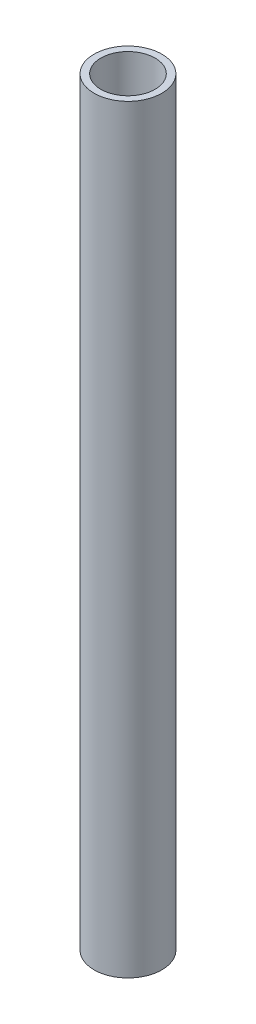
ISO-10303-21;
HEADER;
FILE_DESCRIPTION(('STEP AP214'),'2;1');
FILE_NAME('part.step','',(''),(''),'','','');
FILE_SCHEMA(('AUTOMOTIVE_DESIGN { 1 0 10303 214 1 1 1 1 }'));
ENDSEC;
DATA;
#1=APPLICATION_CONTEXT('core data for automotive mechanical design processes');
#2=APPLICATION_PROTOCOL_DEFINITION('international standard','automotive_design',2000,#1);
#3=PRODUCT_CONTEXT('',#1,'mechanical');
#4=PRODUCT('Part','Part','',(#3));
#5=PRODUCT_RELATED_PRODUCT_CATEGORY('part','',(#4));
#6=PRODUCT_DEFINITION_FORMATION('','',#4);
#7=PRODUCT_DEFINITION_CONTEXT('part definition',#1,'design');
#8=PRODUCT_DEFINITION('design','',#6,#7);
#9=PRODUCT_DEFINITION_SHAPE('','',#8);
#10=(LENGTH_UNIT() NAMED_UNIT(*) SI_UNIT(.MILLI.,.METRE.));
#11=(NAMED_UNIT(*) PLANE_ANGLE_UNIT() SI_UNIT($,.RADIAN.));
#12=(NAMED_UNIT(*) SI_UNIT($,.STERADIAN.) SOLID_ANGLE_UNIT());
#13=UNCERTAINTY_MEASURE_WITH_UNIT(LENGTH_MEASURE(1.E-05),#10,'distance_accuracy_value','');
#14=(GEOMETRIC_REPRESENTATION_CONTEXT(3) GLOBAL_UNCERTAINTY_ASSIGNED_CONTEXT((#13)) GLOBAL_UNIT_ASSIGNED_CONTEXT((#10,
#11,#12)) REPRESENTATION_CONTEXT('',''));
#15=CARTESIAN_POINT('',(0.,0.,0.));
#16=DIRECTION('',(0.,0.,1.));
#17=DIRECTION('',(1.,0.,0.));
#18=AXIS2_PLACEMENT_3D('',#15,#16,#17);
#19=CARTESIAN_POINT('',(0.,28.,0.));
#20=DIRECTION('',(0.,1.,0.));
#21=DIRECTION('',(0.,0.,1.));
#22=AXIS2_PLACEMENT_3D('',#19,#20,#21);
#23=PLANE('',#22);
#24=CARTESIAN_POINT('',(0.,28.,0.));
#25=DIRECTION('',(0.,1.,0.));
#26=DIRECTION('',(0.,0.,1.));
#27=AXIS2_PLACEMENT_3D('',#24,#25,#26);
#28=CIRCLE('',#27,1.25);
#29=CARTESIAN_POINT('',(0.,28.,1.25));
#30=VERTEX_POINT('',#29);
#31=EDGE_CURVE('E10',#30,#30,#28,.T.);
#32=ORIENTED_EDGE('',*,*,#31,.T.);
#33=EDGE_LOOP('',(#32));
#34=FACE_BOUND('',#33,.T.);
#35=CARTESIAN_POINT('',(0.,28.,0.));
#36=DIRECTION('',(0.,1.,0.));
#37=DIRECTION('',(0.,0.,1.));
#38=AXIS2_PLACEMENT_3D('',#35,#36,#37);
#39=CIRCLE('',#38,1.);
#40=CARTESIAN_POINT('',(0.,28.,1.));
#41=VERTEX_POINT('',#40);
#42=EDGE_CURVE('E44',#41,#41,#39,.T.);
#43=ORIENTED_EDGE('',*,*,#42,.F.);
#44=EDGE_LOOP('',(#43));
#45=FACE_BOUND('',#44,.T.);
#46=ADVANCED_FACE('F33',(#34,#45),#23,.T.);
#47=CARTESIAN_POINT('',(0.,0.,0.));
#48=DIRECTION('',(0.,1.,0.));
#49=DIRECTION('',(0.,0.,1.));
#50=AXIS2_PLACEMENT_3D('',#47,#48,#49);
#51=PLANE('',#50);
#52=CARTESIAN_POINT('',(0.,0.,0.));
#53=DIRECTION('',(0.,1.,0.));
#54=DIRECTION('',(0.,0.,1.));
#55=AXIS2_PLACEMENT_3D('',#52,#53,#54);
#56=CIRCLE('',#55,1.25);
#57=CARTESIAN_POINT('',(0.,0.,1.25));
#58=VERTEX_POINT('',#57);
#59=EDGE_CURVE('E37',#58,#58,#56,.T.);
#60=ORIENTED_EDGE('',*,*,#59,.F.);
#61=EDGE_LOOP('',(#60));
#62=FACE_BOUND('',#61,.T.);
#63=CARTESIAN_POINT('',(0.,0.,0.));
#64=DIRECTION('',(0.,1.,0.));
#65=DIRECTION('',(0.,0.,1.));
#66=AXIS2_PLACEMENT_3D('',#63,#64,#65);
#67=CIRCLE('',#66,1.);
#68=CARTESIAN_POINT('',(0.,0.,1.));
#69=VERTEX_POINT('',#68);
#70=EDGE_CURVE('E46',#69,#69,#67,.T.);
#71=ORIENTED_EDGE('',*,*,#70,.T.);
#72=EDGE_LOOP('',(#71));
#73=FACE_BOUND('',#72,.T.);
#74=ADVANCED_FACE('F56',(#62,#73),#51,.F.);
#75=CARTESIAN_POINT('',(0.,28.,0.));
#76=DIRECTION('',(0.,-1.,0.));
#77=DIRECTION('',(0.,0.,-1.));
#78=AXIS2_PLACEMENT_3D('',#75,#76,#77);
#79=CYLINDRICAL_SURFACE('',#78,1.25);
#80=ORIENTED_EDGE('',*,*,#31,.F.);
#81=EDGE_LOOP('',(#80));
#82=FACE_BOUND('',#81,.T.);
#83=ORIENTED_EDGE('',*,*,#59,.T.);
#84=EDGE_LOOP('',(#83));
#85=FACE_BOUND('',#84,.T.);
#86=ADVANCED_FACE('F35',(#82,#85),#79,.T.);
#87=CARTESIAN_POINT('',(0.,28.,0.));
#88=DIRECTION('',(0.,-1.,0.));
#89=DIRECTION('',(0.,0.,-1.));
#90=AXIS2_PLACEMENT_3D('',#87,#88,#89);
#91=CYLINDRICAL_SURFACE('',#90,1.);
#92=ORIENTED_EDGE('',*,*,#42,.T.);
#93=EDGE_LOOP('',(#92));
#94=FACE_BOUND('',#93,.T.);
#95=ORIENTED_EDGE('',*,*,#70,.F.);
#96=EDGE_LOOP('',(#95));
#97=FACE_BOUND('',#96,.T.);
#98=ADVANCED_FACE('F52',(#94,#97),#91,.F.);
#99=CLOSED_SHELL('',(#46,#74,#86,#98));
#100=MANIFOLD_SOLID_BREP('B2',#99);
#101=ADVANCED_BREP_SHAPE_REPRESENTATION('',(#18,#100),#14);
#102=SHAPE_DEFINITION_REPRESENTATION(#9,#101);
ENDSEC;
END-ISO-10303-21;
